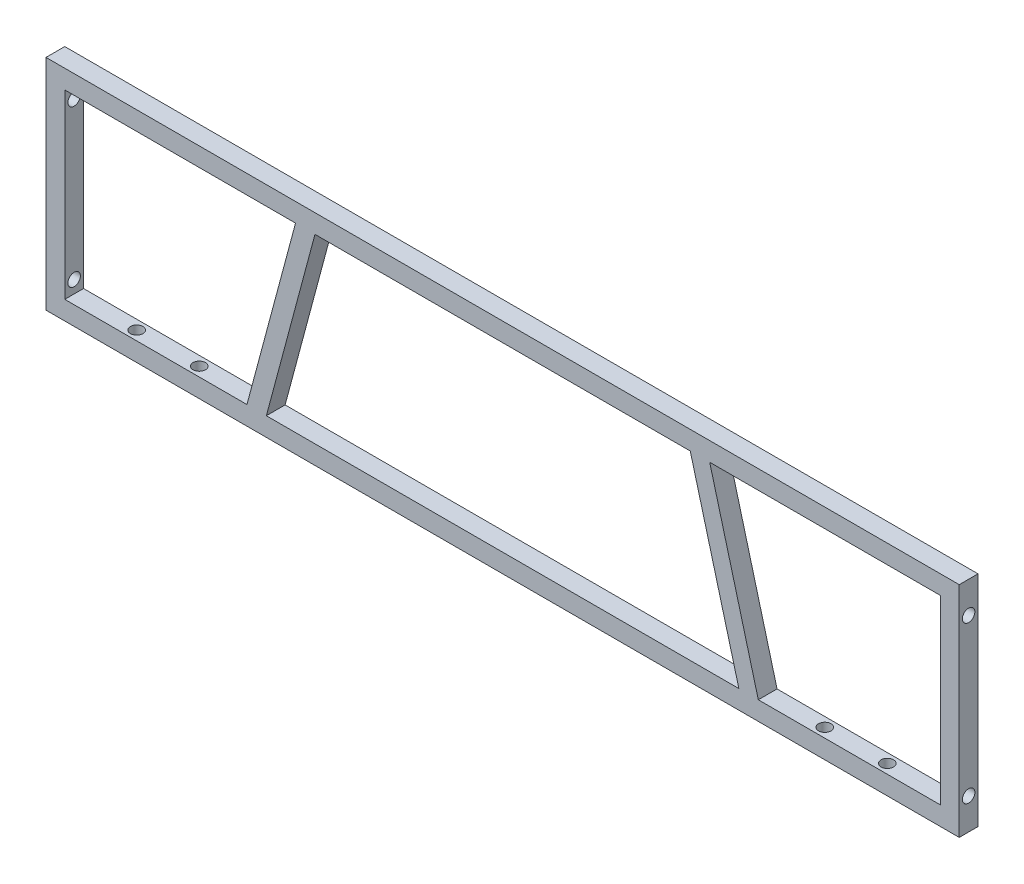
ISO-10303-21;
HEADER;
FILE_DESCRIPTION(('STEP AP214'),'2;1');
FILE_NAME('part.step','',(''),(''),'','','');
FILE_SCHEMA(('AUTOMOTIVE_DESIGN { 1 0 10303 214 1 1 1 1 }'));
ENDSEC;
DATA;
#1=APPLICATION_CONTEXT('core data for automotive mechanical design processes');
#2=APPLICATION_PROTOCOL_DEFINITION('international standard','automotive_design',2000,#1);
#3=PRODUCT_CONTEXT('',#1,'mechanical');
#4=PRODUCT('Part','Part','',(#3));
#5=PRODUCT_RELATED_PRODUCT_CATEGORY('part','',(#4));
#6=PRODUCT_DEFINITION_FORMATION('','',#4);
#7=PRODUCT_DEFINITION_CONTEXT('part definition',#1,'design');
#8=PRODUCT_DEFINITION('design','',#6,#7);
#9=PRODUCT_DEFINITION_SHAPE('','',#8);
#10=(LENGTH_UNIT() NAMED_UNIT(*) SI_UNIT(.MILLI.,.METRE.));
#11=(NAMED_UNIT(*) PLANE_ANGLE_UNIT() SI_UNIT($,.RADIAN.));
#12=(NAMED_UNIT(*) SI_UNIT($,.STERADIAN.) SOLID_ANGLE_UNIT());
#13=UNCERTAINTY_MEASURE_WITH_UNIT(LENGTH_MEASURE(1.E-05),#10,'distance_accuracy_value','');
#14=(GEOMETRIC_REPRESENTATION_CONTEXT(3) GLOBAL_UNCERTAINTY_ASSIGNED_CONTEXT((#13)) GLOBAL_UNIT_ASSIGNED_CONTEXT((#10,
#11,#12)) REPRESENTATION_CONTEXT('',''));
#15=CARTESIAN_POINT('',(0.,0.,0.));
#16=DIRECTION('',(0.,0.,1.));
#17=DIRECTION('',(1.,0.,0.));
#18=AXIS2_PLACEMENT_3D('',#15,#16,#17);
#19=CARTESIAN_POINT('',(-140.,29.,6.00000000000001));
#20=DIRECTION('',(0.,-1.,0.));
#21=DIRECTION('',(0.,0.,-1.));
#22=AXIS2_PLACEMENT_3D('',#19,#20,#21);
#23=PLANE('',#22);
#24=DIRECTION('',(-1.,0.,0.));
#25=VECTOR('',#24,1.);
#26=CARTESIAN_POINT('',(-140.,29.,0.));
#27=LINE('',#26,#25);
#28=CARTESIAN_POINT('',(59.9999999999998,29.,0.));
#29=VERTEX_POINT('',#28);
#30=CARTESIAN_POINT('',(-60.,29.,0.));
#31=VERTEX_POINT('',#30);
#32=EDGE_CURVE('E425',#29,#31,#27,.T.);
#33=ORIENTED_EDGE('',*,*,#32,.F.);
#34=DIRECTION('',(0.,0.,-1.));
#35=VECTOR('',#34,1.);
#36=CARTESIAN_POINT('',(59.9999999999998,29.0000000000004,6.00000000000001));
#37=LINE('',#36,#35);
#38=CARTESIAN_POINT('',(59.9999999999998,29.0000000000004,6.00000000000001));
#39=VERTEX_POINT('',#38);
#40=EDGE_CURVE('E301',#39,#29,#37,.T.);
#41=ORIENTED_EDGE('',*,*,#40,.F.);
#42=DIRECTION('',(-1.,0.,0.));
#43=VECTOR('',#42,1.);
#44=CARTESIAN_POINT('',(-140.,29.,6.00000000000001));
#45=LINE('',#44,#43);
#46=CARTESIAN_POINT('',(-60.,29.,6.00000000000001));
#47=VERTEX_POINT('',#46);
#48=EDGE_CURVE('E169',#39,#47,#45,.T.);
#49=ORIENTED_EDGE('',*,*,#48,.T.);
#50=DIRECTION('',(0.,0.,-1.));
#51=VECTOR('',#50,1.);
#52=CARTESIAN_POINT('',(-60.,29.,6.00000000000001));
#53=LINE('',#52,#51);
#54=EDGE_CURVE('E453',#47,#31,#53,.T.);
#55=ORIENTED_EDGE('',*,*,#54,.T.);
#56=EDGE_LOOP('',(#33,#41,#49,#55));
#57=FACE_BOUND('',#56,.T.);
#58=ADVANCED_FACE('F50',(#57),#23,.T.);
#59=CARTESIAN_POINT('',(140.,29.,6.00000000000001));
#60=VERTEX_POINT('',#59);
#61=CARTESIAN_POINT('',(66.2116570824603,29.0000000000004,6.00000000000001));
#62=VERTEX_POINT('',#61);
#63=EDGE_CURVE('E278',#60,#62,#45,.T.);
#64=ORIENTED_EDGE('',*,*,#63,.T.);
#65=DIRECTION('',(0.,0.,-1.));
#66=VECTOR('',#65,1.);
#67=CARTESIAN_POINT('',(66.2116570824603,29.0000000000004,6.00000000000001));
#68=LINE('',#67,#66);
#69=CARTESIAN_POINT('',(66.2116570824603,29.0000000000004,0.));
#70=VERTEX_POINT('',#69);
#71=EDGE_CURVE('E306',#62,#70,#68,.T.);
#72=ORIENTED_EDGE('',*,*,#71,.T.);
#73=CARTESIAN_POINT('',(140.,29.,0.));
#74=VERTEX_POINT('',#73);
#75=EDGE_CURVE('E200',#74,#70,#27,.T.);
#76=ORIENTED_EDGE('',*,*,#75,.F.);
#77=DIRECTION('',(0.,0.,-1.));
#78=VECTOR('',#77,1.);
#79=CARTESIAN_POINT('',(140.,29.,6.00000000000001));
#80=LINE('',#79,#78);
#81=EDGE_CURVE('E242',#60,#74,#80,.T.);
#82=ORIENTED_EDGE('',*,*,#81,.F.);
#83=EDGE_LOOP('',(#64,#72,#76,#82));
#84=FACE_BOUND('',#83,.T.);
#85=ADVANCED_FACE('F393',(#84),#23,.T.);
#86=CARTESIAN_POINT('',(-140.,-29.,6.00000000000001));
#87=DIRECTION('',(0.,1.,0.));
#88=DIRECTION('',(0.,0.,1.));
#89=AXIS2_PLACEMENT_3D('',#86,#87,#88);
#90=PLANE('',#89);
#91=DIRECTION('',(1.,0.,0.));
#92=VECTOR('',#91,1.);
#93=CARTESIAN_POINT('',(-140.,-29.,6.00000000000001));
#94=LINE('',#93,#92);
#95=CARTESIAN_POINT('',(-75.5410531610054,-29.,6.00000000000001));
#96=VERTEX_POINT('',#95);
#97=CARTESIAN_POINT('',(75.5410531610056,-28.9999999999996,6.00000000000001));
#98=VERTEX_POINT('',#97);
#99=EDGE_CURVE('E168',#96,#98,#94,.T.);
#100=ORIENTED_EDGE('',*,*,#99,.T.);
#101=DIRECTION('',(0.,0.,-1.));
#102=VECTOR('',#101,1.);
#103=CARTESIAN_POINT('',(75.5410531610056,-28.9999999999996,6.00000000000001));
#104=LINE('',#103,#102);
#105=CARTESIAN_POINT('',(75.5410531610056,-28.9999999999996,0.));
#106=VERTEX_POINT('',#105);
#107=EDGE_CURVE('E175',#98,#106,#104,.T.);
#108=ORIENTED_EDGE('',*,*,#107,.T.);
#109=DIRECTION('',(1.,0.,0.));
#110=VECTOR('',#109,1.);
#111=CARTESIAN_POINT('',(-140.,-29.,0.));
#112=LINE('',#111,#110);
#113=CARTESIAN_POINT('',(-75.5410531610054,-29.,0.));
#114=VERTEX_POINT('',#113);
#115=EDGE_CURVE('E429',#114,#106,#112,.T.);
#116=ORIENTED_EDGE('',*,*,#115,.F.);
#117=DIRECTION('',(0.,0.,-1.));
#118=VECTOR('',#117,1.);
#119=CARTESIAN_POINT('',(-75.5410531610054,-29.,6.00000000000001));
#120=LINE('',#119,#118);
#121=EDGE_CURVE('E184',#96,#114,#120,.T.);
#122=ORIENTED_EDGE('',*,*,#121,.F.);
#123=EDGE_LOOP('',(#100,#108,#116,#122));
#124=FACE_BOUND('',#123,.T.);
#125=ADVANCED_FACE('F183',(#124),#90,.T.);
#126=CARTESIAN_POINT('',(100.,-29.,3.));
#127=DIRECTION('',(0.,-1.,0.));
#128=DIRECTION('',(0.,0.,1.));
#129=AXIS2_PLACEMENT_3D('',#126,#127,#128);
#130=CIRCLE('',#129,2.);
#131=CARTESIAN_POINT('',(100.,-29.,5.));
#132=VERTEX_POINT('',#131);
#133=EDGE_CURVE('E352',#132,#132,#130,.T.);
#134=ORIENTED_EDGE('',*,*,#133,.T.);
#135=EDGE_LOOP('',(#134));
#136=FACE_BOUND('',#135,.T.);
#137=CARTESIAN_POINT('',(120.,-29.,3.));
#138=DIRECTION('',(0.,-1.,0.));
#139=DIRECTION('',(0.,0.,1.));
#140=AXIS2_PLACEMENT_3D('',#137,#138,#139);
#141=CIRCLE('',#140,2.);
#142=CARTESIAN_POINT('',(120.,-29.,5.));
#143=VERTEX_POINT('',#142);
#144=EDGE_CURVE('E351',#143,#143,#141,.T.);
#145=ORIENTED_EDGE('',*,*,#144,.T.);
#146=EDGE_LOOP('',(#145));
#147=FACE_BOUND('',#146,.T.);
#148=CARTESIAN_POINT('',(81.7527102434662,-29.,0.));
#149=VERTEX_POINT('',#148);
#150=CARTESIAN_POINT('',(140.,-29.,0.));
#151=VERTEX_POINT('',#150);
#152=EDGE_CURVE('E427',#149,#151,#112,.T.);
#153=ORIENTED_EDGE('',*,*,#152,.F.);
#154=DIRECTION('',(0.,0.,-1.));
#155=VECTOR('',#154,1.);
#156=CARTESIAN_POINT('',(81.7527102434661,-28.9999999999993,6.00000000000001));
#157=LINE('',#156,#155);
#158=CARTESIAN_POINT('',(81.7527102434661,-28.9999999999993,6.00000000000001));
#159=VERTEX_POINT('',#158);
#160=EDGE_CURVE('E180',#159,#149,#157,.T.);
#161=ORIENTED_EDGE('',*,*,#160,.F.);
#162=CARTESIAN_POINT('',(140.,-29.,6.00000000000001));
#163=VERTEX_POINT('',#162);
#164=EDGE_CURVE('E186',#159,#163,#94,.T.);
#165=ORIENTED_EDGE('',*,*,#164,.T.);
#166=DIRECTION('',(0.,0.,-1.));
#167=VECTOR('',#166,1.);
#168=CARTESIAN_POINT('',(140.,-29.,6.00000000000001));
#169=LINE('',#168,#167);
#170=EDGE_CURVE('E189',#163,#151,#169,.T.);
#171=ORIENTED_EDGE('',*,*,#170,.T.);
#172=EDGE_LOOP('',(#153,#161,#165,#171));
#173=FACE_BOUND('',#172,.T.);
#174=ADVANCED_FACE('F406',(#136,#147,#173),#90,.T.);
#175=CARTESIAN_POINT('',(-66.2116570824605,29.,0.));
#176=VERTEX_POINT('',#175);
#177=CARTESIAN_POINT('',(-140.,29.,0.));
#178=VERTEX_POINT('',#177);
#179=EDGE_CURVE('E199',#176,#178,#27,.T.);
#180=ORIENTED_EDGE('',*,*,#179,.F.);
#181=DIRECTION('',(0.,0.,-1.));
#182=VECTOR('',#181,1.);
#183=CARTESIAN_POINT('',(-66.2116570824605,29.,6.00000000000001));
#184=LINE('',#183,#182);
#185=CARTESIAN_POINT('',(-66.2116570824605,29.,6.00000000000001));
#186=VERTEX_POINT('',#185);
#187=EDGE_CURVE('E418',#186,#176,#184,.T.);
#188=ORIENTED_EDGE('',*,*,#187,.F.);
#189=CARTESIAN_POINT('',(-140.,29.,6.00000000000001));
#190=VERTEX_POINT('',#189);
#191=EDGE_CURVE('E281',#186,#190,#45,.T.);
#192=ORIENTED_EDGE('',*,*,#191,.T.);
#193=DIRECTION('',(0.,0.,-1.));
#194=VECTOR('',#193,1.);
#195=CARTESIAN_POINT('',(-140.,29.,6.00000000000001));
#196=LINE('',#195,#194);
#197=EDGE_CURVE('E421',#190,#178,#196,.T.);
#198=ORIENTED_EDGE('',*,*,#197,.T.);
#199=EDGE_LOOP('',(#180,#188,#192,#198));
#200=FACE_BOUND('',#199,.T.);
#201=ADVANCED_FACE('F396',(#200),#23,.T.);
#202=CARTESIAN_POINT('',(-120.,-29.,3.));
#203=DIRECTION('',(0.,-1.,0.));
#204=DIRECTION('',(0.,0.,-1.));
#205=AXIS2_PLACEMENT_3D('',#202,#203,#204);
#206=CIRCLE('',#205,2.);
#207=CARTESIAN_POINT('',(-120.,-29.,1.00000000000001));
#208=VERTEX_POINT('',#207);
#209=EDGE_CURVE('E369',#208,#208,#206,.T.);
#210=ORIENTED_EDGE('',*,*,#209,.T.);
#211=EDGE_LOOP('',(#210));
#212=FACE_BOUND('',#211,.T.);
#213=CARTESIAN_POINT('',(-100.,-29.,3.));
#214=DIRECTION('',(0.,-1.,0.));
#215=DIRECTION('',(0.,0.,-1.));
#216=AXIS2_PLACEMENT_3D('',#213,#214,#215);
#217=CIRCLE('',#216,2.);
#218=CARTESIAN_POINT('',(-100.,-29.,1.00000000000001));
#219=VERTEX_POINT('',#218);
#220=EDGE_CURVE('E358',#219,#219,#217,.T.);
#221=ORIENTED_EDGE('',*,*,#220,.T.);
#222=EDGE_LOOP('',(#221));
#223=FACE_BOUND('',#222,.T.);
#224=CARTESIAN_POINT('',(-140.,-29.,6.00000000000001));
#225=VERTEX_POINT('',#224);
#226=CARTESIAN_POINT('',(-81.7527102434659,-29.,6.00000000000001));
#227=VERTEX_POINT('',#226);
#228=EDGE_CURVE('E185',#225,#227,#94,.T.);
#229=ORIENTED_EDGE('',*,*,#228,.T.);
#230=DIRECTION('',(0.,0.,-1.));
#231=VECTOR('',#230,1.);
#232=CARTESIAN_POINT('',(-81.7527102434659,-29.,6.00000000000001));
#233=LINE('',#232,#231);
#234=CARTESIAN_POINT('',(-81.7527102434659,-29.,0.));
#235=VERTEX_POINT('',#234);
#236=EDGE_CURVE('E315',#227,#235,#233,.T.);
#237=ORIENTED_EDGE('',*,*,#236,.T.);
#238=CARTESIAN_POINT('',(-140.,-29.,0.));
#239=VERTEX_POINT('',#238);
#240=EDGE_CURVE('E431',#239,#235,#112,.T.);
#241=ORIENTED_EDGE('',*,*,#240,.F.);
#242=DIRECTION('',(0.,0.,-1.));
#243=VECTOR('',#242,1.);
#244=CARTESIAN_POINT('',(-140.,-29.,6.00000000000001));
#245=LINE('',#244,#243);
#246=EDGE_CURVE('E435',#225,#239,#245,.T.);
#247=ORIENTED_EDGE('',*,*,#246,.F.);
#248=EDGE_LOOP('',(#229,#237,#241,#247));
#249=FACE_BOUND('',#248,.T.);
#250=ADVANCED_FACE('F405',(#212,#223,#249),#90,.T.);
#251=CARTESIAN_POINT('',(0.,0.,6.00000000000001));
#252=DIRECTION('',(0.,0.,-1.));
#253=DIRECTION('',(-1.,0.,0.));
#254=AXIS2_PLACEMENT_3D('',#251,#252,#253);
#255=PLANE('',#254);
#256=ORIENTED_EDGE('',*,*,#164,.F.);
#257=DIRECTION('',(-0.258819045102532,0.965925826289065,0.));
#258=VECTOR('',#257,1.);
#259=CARTESIAN_POINT('',(81.7527102434661,-28.9999999999993,6.00000000000001));
#260=LINE('',#259,#258);
#261=EDGE_CURVE('E172',#159,#62,#260,.T.);
#262=ORIENTED_EDGE('',*,*,#261,.T.);
#263=ORIENTED_EDGE('',*,*,#63,.F.);
#264=DIRECTION('',(0.,1.,0.));
#265=VECTOR('',#264,1.);
#266=CARTESIAN_POINT('',(140.,-29.,6.00000000000001));
#267=LINE('',#266,#265);
#268=EDGE_CURVE('E282',#163,#60,#267,.T.);
#269=ORIENTED_EDGE('',*,*,#268,.F.);
#270=EDGE_LOOP('',(#256,#262,#263,#269));
#271=FACE_BOUND('',#270,.T.);
#272=ORIENTED_EDGE('',*,*,#191,.F.);
#273=DIRECTION('',(-0.258819045102525,-0.965925826289067,0.));
#274=VECTOR('',#273,1.);
#275=CARTESIAN_POINT('',(-81.7527102434659,-29.,6.00000000000001));
#276=LINE('',#275,#274);
#277=EDGE_CURVE('E312',#186,#227,#276,.T.);
#278=ORIENTED_EDGE('',*,*,#277,.T.);
#279=ORIENTED_EDGE('',*,*,#228,.F.);
#280=DIRECTION('',(0.,-1.,0.));
#281=VECTOR('',#280,1.);
#282=CARTESIAN_POINT('',(-140.,-29.,6.00000000000001));
#283=LINE('',#282,#281);
#284=EDGE_CURVE('E190',#190,#225,#283,.T.);
#285=ORIENTED_EDGE('',*,*,#284,.F.);
#286=EDGE_LOOP('',(#272,#278,#279,#285));
#287=FACE_BOUND('',#286,.T.);
#288=DIRECTION('',(0.,1.,0.));
#289=VECTOR('',#288,1.);
#290=CARTESIAN_POINT('',(146.,-35.,6.00000000000001));
#291=LINE('',#290,#289);
#292=CARTESIAN_POINT('',(146.,-35.,6.00000000000001));
#293=VERTEX_POINT('',#292);
#294=CARTESIAN_POINT('',(146.,35.,6.00000000000001));
#295=VERTEX_POINT('',#294);
#296=EDGE_CURVE('E217',#293,#295,#291,.T.);
#297=ORIENTED_EDGE('',*,*,#296,.T.);
#298=DIRECTION('',(-1.,0.,0.));
#299=VECTOR('',#298,1.);
#300=CARTESIAN_POINT('',(-146.,35.,6.00000000000001));
#301=LINE('',#300,#299);
#302=CARTESIAN_POINT('',(-146.,35.,6.00000000000001));
#303=VERTEX_POINT('',#302);
#304=EDGE_CURVE('E251',#295,#303,#301,.T.);
#305=ORIENTED_EDGE('',*,*,#304,.T.);
#306=DIRECTION('',(0.,-1.,0.));
#307=VECTOR('',#306,1.);
#308=CARTESIAN_POINT('',(-146.,-35.,6.00000000000001));
#309=LINE('',#308,#307);
#310=CARTESIAN_POINT('',(-146.,-35.,6.00000000000001));
#311=VERTEX_POINT('',#310);
#312=EDGE_CURVE('E233',#303,#311,#309,.T.);
#313=ORIENTED_EDGE('',*,*,#312,.T.);
#314=DIRECTION('',(1.,0.,0.));
#315=VECTOR('',#314,1.);
#316=CARTESIAN_POINT('',(-146.,-35.,6.00000000000001));
#317=LINE('',#316,#315);
#318=EDGE_CURVE('E224',#311,#293,#317,.T.);
#319=ORIENTED_EDGE('',*,*,#318,.T.);
#320=EDGE_LOOP('',(#297,#305,#313,#319));
#321=FACE_BOUND('',#320,.T.);
#322=DIRECTION('',(0.258819045102531,-0.965925826289066,0.));
#323=VECTOR('',#322,1.);
#324=CARTESIAN_POINT('',(59.9999999999998,29.0000000000004,6.00000000000001));
#325=LINE('',#324,#323);
#326=EDGE_CURVE('E163',#39,#98,#325,.T.);
#327=ORIENTED_EDGE('',*,*,#326,.T.);
#328=ORIENTED_EDGE('',*,*,#99,.F.);
#329=DIRECTION('',(0.258819045102525,0.965925826289067,0.));
#330=VECTOR('',#329,1.);
#331=CARTESIAN_POINT('',(-60.,29.,6.00000000000001));
#332=LINE('',#331,#330);
#333=EDGE_CURVE('E310',#96,#47,#332,.T.);
#334=ORIENTED_EDGE('',*,*,#333,.T.);
#335=ORIENTED_EDGE('',*,*,#48,.F.);
#336=EDGE_LOOP('',(#327,#328,#334,#335));
#337=FACE_BOUND('',#336,.T.);
#338=ADVANCED_FACE('F165',(#271,#287,#321,#337),#255,.F.);
#339=CARTESIAN_POINT('',(0.,0.,0.));
#340=DIRECTION('',(0.,0.,-1.));
#341=DIRECTION('',(-1.,0.,0.));
#342=AXIS2_PLACEMENT_3D('',#339,#340,#341);
#343=PLANE('',#342);
#344=DIRECTION('',(-0.258819045102532,0.965925826289065,0.));
#345=VECTOR('',#344,1.);
#346=CARTESIAN_POINT('',(81.7527102434661,-28.9999999999993,0.));
#347=LINE('',#346,#345);
#348=EDGE_CURVE('E65',#149,#70,#347,.T.);
#349=ORIENTED_EDGE('',*,*,#348,.F.);
#350=ORIENTED_EDGE('',*,*,#152,.T.);
#351=DIRECTION('',(0.,1.,0.));
#352=VECTOR('',#351,1.);
#353=CARTESIAN_POINT('',(140.,-29.,0.));
#354=LINE('',#353,#352);
#355=EDGE_CURVE('E195',#151,#74,#354,.T.);
#356=ORIENTED_EDGE('',*,*,#355,.T.);
#357=ORIENTED_EDGE('',*,*,#75,.T.);
#358=EDGE_LOOP('',(#349,#350,#356,#357));
#359=FACE_BOUND('',#358,.T.);
#360=DIRECTION('',(-0.258819045102525,-0.965925826289067,0.));
#361=VECTOR('',#360,1.);
#362=CARTESIAN_POINT('',(-81.7527102434659,-29.,0.));
#363=LINE('',#362,#361);
#364=EDGE_CURVE('E313',#176,#235,#363,.T.);
#365=ORIENTED_EDGE('',*,*,#364,.F.);
#366=ORIENTED_EDGE('',*,*,#179,.T.);
#367=DIRECTION('',(0.,-1.,0.));
#368=VECTOR('',#367,1.);
#369=CARTESIAN_POINT('',(-140.,-29.,0.));
#370=LINE('',#369,#368);
#371=EDGE_CURVE('E426',#178,#239,#370,.T.);
#372=ORIENTED_EDGE('',*,*,#371,.T.);
#373=ORIENTED_EDGE('',*,*,#240,.T.);
#374=EDGE_LOOP('',(#365,#366,#372,#373));
#375=FACE_BOUND('',#374,.T.);
#376=DIRECTION('',(0.,1.,0.));
#377=VECTOR('',#376,1.);
#378=CARTESIAN_POINT('',(146.,-35.,0.));
#379=LINE('',#378,#377);
#380=CARTESIAN_POINT('',(146.,-35.,0.));
#381=VERTEX_POINT('',#380);
#382=CARTESIAN_POINT('',(146.,35.,0.));
#383=VERTEX_POINT('',#382);
#384=EDGE_CURVE('E240',#381,#383,#379,.T.);
#385=ORIENTED_EDGE('',*,*,#384,.F.);
#386=DIRECTION('',(1.,0.,0.));
#387=VECTOR('',#386,1.);
#388=CARTESIAN_POINT('',(-146.,-35.,0.));
#389=LINE('',#388,#387);
#390=CARTESIAN_POINT('',(-146.,-35.,0.));
#391=VERTEX_POINT('',#390);
#392=EDGE_CURVE('E213',#391,#381,#389,.T.);
#393=ORIENTED_EDGE('',*,*,#392,.F.);
#394=DIRECTION('',(0.,-1.,0.));
#395=VECTOR('',#394,1.);
#396=CARTESIAN_POINT('',(-146.,-35.,0.));
#397=LINE('',#396,#395);
#398=CARTESIAN_POINT('',(-146.,35.,0.));
#399=VERTEX_POINT('',#398);
#400=EDGE_CURVE('E218',#399,#391,#397,.T.);
#401=ORIENTED_EDGE('',*,*,#400,.F.);
#402=DIRECTION('',(-1.,0.,0.));
#403=VECTOR('',#402,1.);
#404=CARTESIAN_POINT('',(-146.,35.,0.));
#405=LINE('',#404,#403);
#406=EDGE_CURVE('E239',#383,#399,#405,.T.);
#407=ORIENTED_EDGE('',*,*,#406,.F.);
#408=EDGE_LOOP('',(#385,#393,#401,#407));
#409=FACE_BOUND('',#408,.T.);
#410=ORIENTED_EDGE('',*,*,#115,.T.);
#411=DIRECTION('',(0.258819045102531,-0.965925826289066,0.));
#412=VECTOR('',#411,1.);
#413=CARTESIAN_POINT('',(59.9999999999998,29.0000000000004,0.));
#414=LINE('',#413,#412);
#415=EDGE_CURVE('E73',#29,#106,#414,.T.);
#416=ORIENTED_EDGE('',*,*,#415,.F.);
#417=ORIENTED_EDGE('',*,*,#32,.T.);
#418=DIRECTION('',(0.258819045102525,0.965925826289067,0.));
#419=VECTOR('',#418,1.);
#420=CARTESIAN_POINT('',(-60.,29.,0.));
#421=LINE('',#420,#419);
#422=EDGE_CURVE('E179',#114,#31,#421,.T.);
#423=ORIENTED_EDGE('',*,*,#422,.F.);
#424=EDGE_LOOP('',(#410,#416,#417,#423));
#425=FACE_BOUND('',#424,.T.);
#426=ADVANCED_FACE('F238',(#359,#375,#409,#425),#343,.T.);
#427=CARTESIAN_POINT('',(146.,-35.,6.00000000000001));
#428=DIRECTION('',(-1.,0.,0.));
#429=DIRECTION('',(0.,0.,1.));
#430=AXIS2_PLACEMENT_3D('',#427,#428,#429);
#431=PLANE('',#430);
#432=CARTESIAN_POINT('',(146.,25.,3.));
#433=DIRECTION('',(-1.,0.,0.));
#434=DIRECTION('',(0.,0.,1.));
#435=AXIS2_PLACEMENT_3D('',#432,#433,#434);
#436=CIRCLE('',#435,2.);
#437=CARTESIAN_POINT('',(146.,25.,5.));
#438=VERTEX_POINT('',#437);
#439=EDGE_CURVE('E293',#438,#438,#436,.T.);
#440=ORIENTED_EDGE('',*,*,#439,.T.);
#441=EDGE_LOOP('',(#440));
#442=FACE_BOUND('',#441,.T.);
#443=CARTESIAN_POINT('',(146.,-25.,3.));
#444=DIRECTION('',(-1.,0.,0.));
#445=DIRECTION('',(0.,0.,1.));
#446=AXIS2_PLACEMENT_3D('',#443,#444,#445);
#447=CIRCLE('',#446,2.);
#448=CARTESIAN_POINT('',(146.,-25.,5.));
#449=VERTEX_POINT('',#448);
#450=EDGE_CURVE('E294',#449,#449,#447,.T.);
#451=ORIENTED_EDGE('',*,*,#450,.T.);
#452=EDGE_LOOP('',(#451));
#453=FACE_BOUND('',#452,.T.);
#454=ORIENTED_EDGE('',*,*,#384,.T.);
#455=DIRECTION('',(0.,0.,-1.));
#456=VECTOR('',#455,1.);
#457=CARTESIAN_POINT('',(146.,35.,6.00000000000001));
#458=LINE('',#457,#456);
#459=EDGE_CURVE('E12',#295,#383,#458,.T.);
#460=ORIENTED_EDGE('',*,*,#459,.F.);
#461=ORIENTED_EDGE('',*,*,#296,.F.);
#462=DIRECTION('',(0.,0.,-1.));
#463=VECTOR('',#462,1.);
#464=CARTESIAN_POINT('',(146.,-35.,6.00000000000001));
#465=LINE('',#464,#463);
#466=EDGE_CURVE('E220',#293,#381,#465,.T.);
#467=ORIENTED_EDGE('',*,*,#466,.T.);
#468=EDGE_LOOP('',(#454,#460,#461,#467));
#469=FACE_BOUND('',#468,.T.);
#470=ADVANCED_FACE('F52',(#442,#453,#469),#431,.F.);
#471=CARTESIAN_POINT('',(-146.,35.,6.00000000000001));
#472=DIRECTION('',(0.,-1.,0.));
#473=DIRECTION('',(0.,0.,-1.));
#474=AXIS2_PLACEMENT_3D('',#471,#472,#473);
#475=PLANE('',#474);
#476=ORIENTED_EDGE('',*,*,#406,.T.);
#477=DIRECTION('',(0.,0.,-1.));
#478=VECTOR('',#477,1.);
#479=CARTESIAN_POINT('',(-146.,35.,6.00000000000001));
#480=LINE('',#479,#478);
#481=EDGE_CURVE('E58',#303,#399,#480,.T.);
#482=ORIENTED_EDGE('',*,*,#481,.F.);
#483=ORIENTED_EDGE('',*,*,#304,.F.);
#484=ORIENTED_EDGE('',*,*,#459,.T.);
#485=EDGE_LOOP('',(#476,#482,#483,#484));
#486=FACE_BOUND('',#485,.T.);
#487=ADVANCED_FACE('F335',(#486),#475,.F.);
#488=CARTESIAN_POINT('',(-146.,-35.,6.00000000000001));
#489=DIRECTION('',(1.,0.,0.));
#490=DIRECTION('',(0.,0.,-1.));
#491=AXIS2_PLACEMENT_3D('',#488,#489,#490);
#492=PLANE('',#491);
#493=CARTESIAN_POINT('',(-146.,25.,3.));
#494=DIRECTION('',(-1.,0.,0.));
#495=DIRECTION('',(0.,0.,1.));
#496=AXIS2_PLACEMENT_3D('',#493,#494,#495);
#497=CIRCLE('',#496,2.);
#498=CARTESIAN_POINT('',(-146.,25.,5.));
#499=VERTEX_POINT('',#498);
#500=EDGE_CURVE('E272',#499,#499,#497,.T.);
#501=ORIENTED_EDGE('',*,*,#500,.F.);
#502=EDGE_LOOP('',(#501));
#503=FACE_BOUND('',#502,.T.);
#504=CARTESIAN_POINT('',(-146.,-25.,3.));
#505=DIRECTION('',(-1.,0.,0.));
#506=DIRECTION('',(0.,0.,1.));
#507=AXIS2_PLACEMENT_3D('',#504,#505,#506);
#508=CIRCLE('',#507,2.);
#509=CARTESIAN_POINT('',(-146.,-25.,5.));
#510=VERTEX_POINT('',#509);
#511=EDGE_CURVE('E273',#510,#510,#508,.T.);
#512=ORIENTED_EDGE('',*,*,#511,.F.);
#513=EDGE_LOOP('',(#512));
#514=FACE_BOUND('',#513,.T.);
#515=ORIENTED_EDGE('',*,*,#400,.T.);
#516=DIRECTION('',(0.,0.,-1.));
#517=VECTOR('',#516,1.);
#518=CARTESIAN_POINT('',(-146.,-35.,6.00000000000001));
#519=LINE('',#518,#517);
#520=EDGE_CURVE('E223',#311,#391,#519,.T.);
#521=ORIENTED_EDGE('',*,*,#520,.F.);
#522=ORIENTED_EDGE('',*,*,#312,.F.);
#523=ORIENTED_EDGE('',*,*,#481,.T.);
#524=EDGE_LOOP('',(#515,#521,#522,#523));
#525=FACE_BOUND('',#524,.T.);
#526=ADVANCED_FACE('F231',(#503,#514,#525),#492,.F.);
#527=CARTESIAN_POINT('',(-146.,-35.,6.00000000000001));
#528=DIRECTION('',(0.,1.,0.));
#529=DIRECTION('',(0.,0.,1.));
#530=AXIS2_PLACEMENT_3D('',#527,#528,#529);
#531=PLANE('',#530);
#532=CARTESIAN_POINT('',(-120.,-35.,3.));
#533=DIRECTION('',(0.,-1.,0.));
#534=DIRECTION('',(0.,0.,-1.));
#535=AXIS2_PLACEMENT_3D('',#532,#533,#534);
#536=CIRCLE('',#535,2.);
#537=CARTESIAN_POINT('',(-120.,-35.,1.00000000000001));
#538=VERTEX_POINT('',#537);
#539=EDGE_CURVE('E361',#538,#538,#536,.T.);
#540=ORIENTED_EDGE('',*,*,#539,.F.);
#541=EDGE_LOOP('',(#540));
#542=FACE_BOUND('',#541,.T.);
#543=CARTESIAN_POINT('',(100.,-35.,3.));
#544=DIRECTION('',(0.,-1.,0.));
#545=DIRECTION('',(0.,0.,1.));
#546=AXIS2_PLACEMENT_3D('',#543,#544,#545);
#547=CIRCLE('',#546,2.);
#548=CARTESIAN_POINT('',(100.,-35.,5.));
#549=VERTEX_POINT('',#548);
#550=EDGE_CURVE('E362',#549,#549,#547,.T.);
#551=ORIENTED_EDGE('',*,*,#550,.F.);
#552=EDGE_LOOP('',(#551));
#553=FACE_BOUND('',#552,.T.);
#554=CARTESIAN_POINT('',(120.,-35.,3.));
#555=DIRECTION('',(0.,-1.,0.));
#556=DIRECTION('',(0.,0.,1.));
#557=AXIS2_PLACEMENT_3D('',#554,#555,#556);
#558=CIRCLE('',#557,2.);
#559=CARTESIAN_POINT('',(120.,-35.,5.));
#560=VERTEX_POINT('',#559);
#561=EDGE_CURVE('E347',#560,#560,#558,.T.);
#562=ORIENTED_EDGE('',*,*,#561,.F.);
#563=EDGE_LOOP('',(#562));
#564=FACE_BOUND('',#563,.T.);
#565=CARTESIAN_POINT('',(-100.,-35.,3.));
#566=DIRECTION('',(0.,-1.,0.));
#567=DIRECTION('',(0.,0.,-1.));
#568=AXIS2_PLACEMENT_3D('',#565,#566,#567);
#569=CIRCLE('',#568,2.);
#570=CARTESIAN_POINT('',(-100.,-35.,1.00000000000001));
#571=VERTEX_POINT('',#570);
#572=EDGE_CURVE('E355',#571,#571,#569,.T.);
#573=ORIENTED_EDGE('',*,*,#572,.F.);
#574=EDGE_LOOP('',(#573));
#575=FACE_BOUND('',#574,.T.);
#576=ORIENTED_EDGE('',*,*,#392,.T.);
#577=ORIENTED_EDGE('',*,*,#466,.F.);
#578=ORIENTED_EDGE('',*,*,#318,.F.);
#579=ORIENTED_EDGE('',*,*,#520,.T.);
#580=EDGE_LOOP('',(#576,#577,#578,#579));
#581=FACE_BOUND('',#580,.T.);
#582=ADVANCED_FACE('F334',(#542,#553,#564,#575,#581),#531,.F.);
#583=CARTESIAN_POINT('',(140.,-29.,6.00000000000001));
#584=DIRECTION('',(-1.,0.,0.));
#585=DIRECTION('',(0.,0.,1.));
#586=AXIS2_PLACEMENT_3D('',#583,#584,#585);
#587=PLANE('',#586);
#588=CARTESIAN_POINT('',(140.,25.,3.));
#589=DIRECTION('',(-1.,0.,0.));
#590=DIRECTION('',(0.,0.,1.));
#591=AXIS2_PLACEMENT_3D('',#588,#589,#590);
#592=CIRCLE('',#591,2.);
#593=CARTESIAN_POINT('',(140.,25.,5.));
#594=VERTEX_POINT('',#593);
#595=EDGE_CURVE('E340',#594,#594,#592,.T.);
#596=ORIENTED_EDGE('',*,*,#595,.F.);
#597=EDGE_LOOP('',(#596));
#598=FACE_BOUND('',#597,.T.);
#599=CARTESIAN_POINT('',(140.,-25.,3.));
#600=DIRECTION('',(-1.,0.,0.));
#601=DIRECTION('',(0.,0.,1.));
#602=AXIS2_PLACEMENT_3D('',#599,#600,#601);
#603=CIRCLE('',#602,2.);
#604=CARTESIAN_POINT('',(140.,-25.,5.));
#605=VERTEX_POINT('',#604);
#606=EDGE_CURVE('E288',#605,#605,#603,.T.);
#607=ORIENTED_EDGE('',*,*,#606,.F.);
#608=EDGE_LOOP('',(#607));
#609=FACE_BOUND('',#608,.T.);
#610=ORIENTED_EDGE('',*,*,#355,.F.);
#611=ORIENTED_EDGE('',*,*,#170,.F.);
#612=ORIENTED_EDGE('',*,*,#268,.T.);
#613=ORIENTED_EDGE('',*,*,#81,.T.);
#614=EDGE_LOOP('',(#610,#611,#612,#613));
#615=FACE_BOUND('',#614,.T.);
#616=ADVANCED_FACE('F441',(#598,#609,#615),#587,.T.);
#617=CARTESIAN_POINT('',(-140.,-29.,6.00000000000001));
#618=DIRECTION('',(1.,0.,0.));
#619=DIRECTION('',(0.,0.,-1.));
#620=AXIS2_PLACEMENT_3D('',#617,#618,#619);
#621=PLANE('',#620);
#622=CARTESIAN_POINT('',(-140.,25.,3.));
#623=DIRECTION('',(-1.,0.,0.));
#624=DIRECTION('',(0.,0.,1.));
#625=AXIS2_PLACEMENT_3D('',#622,#623,#624);
#626=CIRCLE('',#625,2.);
#627=CARTESIAN_POINT('',(-140.,25.,5.));
#628=VERTEX_POINT('',#627);
#629=EDGE_CURVE('E302',#628,#628,#626,.T.);
#630=ORIENTED_EDGE('',*,*,#629,.T.);
#631=EDGE_LOOP('',(#630));
#632=FACE_BOUND('',#631,.T.);
#633=CARTESIAN_POINT('',(-140.,-25.,3.));
#634=DIRECTION('',(-1.,0.,0.));
#635=DIRECTION('',(0.,0.,1.));
#636=AXIS2_PLACEMENT_3D('',#633,#634,#635);
#637=CIRCLE('',#636,2.);
#638=CARTESIAN_POINT('',(-140.,-25.,5.));
#639=VERTEX_POINT('',#638);
#640=EDGE_CURVE('E267',#639,#639,#637,.T.);
#641=ORIENTED_EDGE('',*,*,#640,.T.);
#642=EDGE_LOOP('',(#641));
#643=FACE_BOUND('',#642,.T.);
#644=ORIENTED_EDGE('',*,*,#371,.F.);
#645=ORIENTED_EDGE('',*,*,#197,.F.);
#646=ORIENTED_EDGE('',*,*,#284,.T.);
#647=ORIENTED_EDGE('',*,*,#246,.T.);
#648=EDGE_LOOP('',(#644,#645,#646,#647));
#649=FACE_BOUND('',#648,.T.);
#650=ADVANCED_FACE('F473',(#632,#643,#649),#621,.T.);
#651=CARTESIAN_POINT('',(-60.,29.,6.00000000000001));
#652=DIRECTION('',(-0.965925826289067,0.258819045102525,0.));
#653=DIRECTION('',(-0.258819045102525,-0.965925826289067,0.));
#654=AXIS2_PLACEMENT_3D('',#651,#652,#653);
#655=PLANE('',#654);
#656=ORIENTED_EDGE('',*,*,#422,.T.);
#657=ORIENTED_EDGE('',*,*,#54,.F.);
#658=ORIENTED_EDGE('',*,*,#333,.F.);
#659=ORIENTED_EDGE('',*,*,#121,.T.);
#660=EDGE_LOOP('',(#656,#657,#658,#659));
#661=FACE_BOUND('',#660,.T.);
#662=ADVANCED_FACE('F455',(#661),#655,.F.);
#663=CARTESIAN_POINT('',(-81.7527102434659,-29.,6.00000000000001));
#664=DIRECTION('',(0.965925826289067,-0.258819045102525,0.));
#665=DIRECTION('',(0.258819045102525,0.965925826289067,0.));
#666=AXIS2_PLACEMENT_3D('',#663,#664,#665);
#667=PLANE('',#666);
#668=ORIENTED_EDGE('',*,*,#364,.T.);
#669=ORIENTED_EDGE('',*,*,#236,.F.);
#670=ORIENTED_EDGE('',*,*,#277,.F.);
#671=ORIENTED_EDGE('',*,*,#187,.T.);
#672=EDGE_LOOP('',(#668,#669,#670,#671));
#673=FACE_BOUND('',#672,.T.);
#674=ADVANCED_FACE('F464',(#673),#667,.F.);
#675=CARTESIAN_POINT('',(59.9999999999998,29.0000000000004,6.00000000000001));
#676=DIRECTION('',(0.965925826289065,0.258819045102531,0.));
#677=DIRECTION('',(-0.258819045102531,0.965925826289066,0.));
#678=AXIS2_PLACEMENT_3D('',#675,#676,#677);
#679=PLANE('',#678);
#680=ORIENTED_EDGE('',*,*,#415,.T.);
#681=ORIENTED_EDGE('',*,*,#107,.F.);
#682=ORIENTED_EDGE('',*,*,#326,.F.);
#683=ORIENTED_EDGE('',*,*,#40,.T.);
#684=EDGE_LOOP('',(#680,#681,#682,#683));
#685=FACE_BOUND('',#684,.T.);
#686=ADVANCED_FACE('F176',(#685),#679,.F.);
#687=CARTESIAN_POINT('',(81.7527102434661,-28.9999999999993,6.00000000000001));
#688=DIRECTION('',(-0.965925826289065,-0.258819045102532,0.));
#689=DIRECTION('',(0.258819045102532,-0.965925826289066,0.));
#690=AXIS2_PLACEMENT_3D('',#687,#688,#689);
#691=PLANE('',#690);
#692=ORIENTED_EDGE('',*,*,#348,.T.);
#693=ORIENTED_EDGE('',*,*,#71,.F.);
#694=ORIENTED_EDGE('',*,*,#261,.F.);
#695=ORIENTED_EDGE('',*,*,#160,.T.);
#696=EDGE_LOOP('',(#692,#693,#694,#695));
#697=FACE_BOUND('',#696,.T.);
#698=ADVANCED_FACE('F471',(#697),#691,.F.);
#699=CARTESIAN_POINT('',(-140.,-25.,3.));
#700=DIRECTION('',(-1.,0.,0.));
#701=DIRECTION('',(0.,0.,1.));
#702=AXIS2_PLACEMENT_3D('',#699,#700,#701);
#703=CYLINDRICAL_SURFACE('',#702,2.);
#704=ORIENTED_EDGE('',*,*,#640,.F.);
#705=EDGE_LOOP('',(#704));
#706=FACE_BOUND('',#705,.T.);
#707=ORIENTED_EDGE('',*,*,#511,.T.);
#708=EDGE_LOOP('',(#707));
#709=FACE_BOUND('',#708,.T.);
#710=ADVANCED_FACE('F389',(#706,#709),#703,.F.);
#711=CARTESIAN_POINT('',(-140.,25.,3.));
#712=DIRECTION('',(-1.,0.,0.));
#713=DIRECTION('',(0.,0.,1.));
#714=AXIS2_PLACEMENT_3D('',#711,#712,#713);
#715=CYLINDRICAL_SURFACE('',#714,2.);
#716=ORIENTED_EDGE('',*,*,#629,.F.);
#717=EDGE_LOOP('',(#716));
#718=FACE_BOUND('',#717,.T.);
#719=ORIENTED_EDGE('',*,*,#500,.T.);
#720=EDGE_LOOP('',(#719));
#721=FACE_BOUND('',#720,.T.);
#722=ADVANCED_FACE('F330',(#718,#721),#715,.F.);
#723=CARTESIAN_POINT('',(140.,-25.,3.));
#724=DIRECTION('',(1.,0.,0.));
#725=DIRECTION('',(0.,0.,-1.));
#726=AXIS2_PLACEMENT_3D('',#723,#724,#725);
#727=CYLINDRICAL_SURFACE('',#726,2.);
#728=ORIENTED_EDGE('',*,*,#606,.T.);
#729=EDGE_LOOP('',(#728));
#730=FACE_BOUND('',#729,.T.);
#731=ORIENTED_EDGE('',*,*,#450,.F.);
#732=EDGE_LOOP('',(#731));
#733=FACE_BOUND('',#732,.T.);
#734=ADVANCED_FACE('F378',(#730,#733),#727,.F.);
#735=CARTESIAN_POINT('',(140.,25.,3.));
#736=DIRECTION('',(1.,0.,0.));
#737=DIRECTION('',(0.,0.,-1.));
#738=AXIS2_PLACEMENT_3D('',#735,#736,#737);
#739=CYLINDRICAL_SURFACE('',#738,2.);
#740=ORIENTED_EDGE('',*,*,#595,.T.);
#741=EDGE_LOOP('',(#740));
#742=FACE_BOUND('',#741,.T.);
#743=ORIENTED_EDGE('',*,*,#439,.F.);
#744=EDGE_LOOP('',(#743));
#745=FACE_BOUND('',#744,.T.);
#746=ADVANCED_FACE('F380',(#742,#745),#739,.F.);
#747=CARTESIAN_POINT('',(-100.,-29.,3.));
#748=DIRECTION('',(0.,-1.,0.));
#749=DIRECTION('',(0.,0.,-1.));
#750=AXIS2_PLACEMENT_3D('',#747,#748,#749);
#751=CYLINDRICAL_SURFACE('',#750,2.);
#752=ORIENTED_EDGE('',*,*,#220,.F.);
#753=EDGE_LOOP('',(#752));
#754=FACE_BOUND('',#753,.T.);
#755=ORIENTED_EDGE('',*,*,#572,.T.);
#756=EDGE_LOOP('',(#755));
#757=FACE_BOUND('',#756,.T.);
#758=ADVANCED_FACE('F387',(#754,#757),#751,.F.);
#759=CARTESIAN_POINT('',(120.,-29.,3.));
#760=DIRECTION('',(0.,-1.,0.));
#761=DIRECTION('',(0.,0.,-1.));
#762=AXIS2_PLACEMENT_3D('',#759,#760,#761);
#763=CYLINDRICAL_SURFACE('',#762,2.);
#764=ORIENTED_EDGE('',*,*,#144,.F.);
#765=EDGE_LOOP('',(#764));
#766=FACE_BOUND('',#765,.T.);
#767=ORIENTED_EDGE('',*,*,#561,.T.);
#768=EDGE_LOOP('',(#767));
#769=FACE_BOUND('',#768,.T.);
#770=ADVANCED_FACE('F607',(#766,#769),#763,.F.);
#771=CARTESIAN_POINT('',(100.,-29.,3.));
#772=DIRECTION('',(0.,-1.,0.));
#773=DIRECTION('',(0.,0.,-1.));
#774=AXIS2_PLACEMENT_3D('',#771,#772,#773);
#775=CYLINDRICAL_SURFACE('',#774,2.);
#776=ORIENTED_EDGE('',*,*,#133,.F.);
#777=EDGE_LOOP('',(#776));
#778=FACE_BOUND('',#777,.T.);
#779=ORIENTED_EDGE('',*,*,#550,.T.);
#780=EDGE_LOOP('',(#779));
#781=FACE_BOUND('',#780,.T.);
#782=ADVANCED_FACE('F615',(#778,#781),#775,.F.);
#783=CARTESIAN_POINT('',(-120.,-29.,3.));
#784=DIRECTION('',(0.,-1.,0.));
#785=DIRECTION('',(0.,0.,-1.));
#786=AXIS2_PLACEMENT_3D('',#783,#784,#785);
#787=CYLINDRICAL_SURFACE('',#786,2.);
#788=ORIENTED_EDGE('',*,*,#209,.F.);
#789=EDGE_LOOP('',(#788));
#790=FACE_BOUND('',#789,.T.);
#791=ORIENTED_EDGE('',*,*,#539,.T.);
#792=EDGE_LOOP('',(#791));
#793=FACE_BOUND('',#792,.T.);
#794=ADVANCED_FACE('F623',(#790,#793),#787,.F.);
#795=CLOSED_SHELL('',(#58,#85,#125,#174,#201,#250,#338,#426,#470,#487,#526,#582,#616,#650,#662,
#674,#686,#698,#710,#722,#734,#746,#758,#770,#782,#794));
#796=MANIFOLD_SOLID_BREP('B2',#795);
#797=ADVANCED_BREP_SHAPE_REPRESENTATION('',(#18,#796),#14);
#798=SHAPE_DEFINITION_REPRESENTATION(#9,#797);
ENDSEC;
END-ISO-10303-21;
